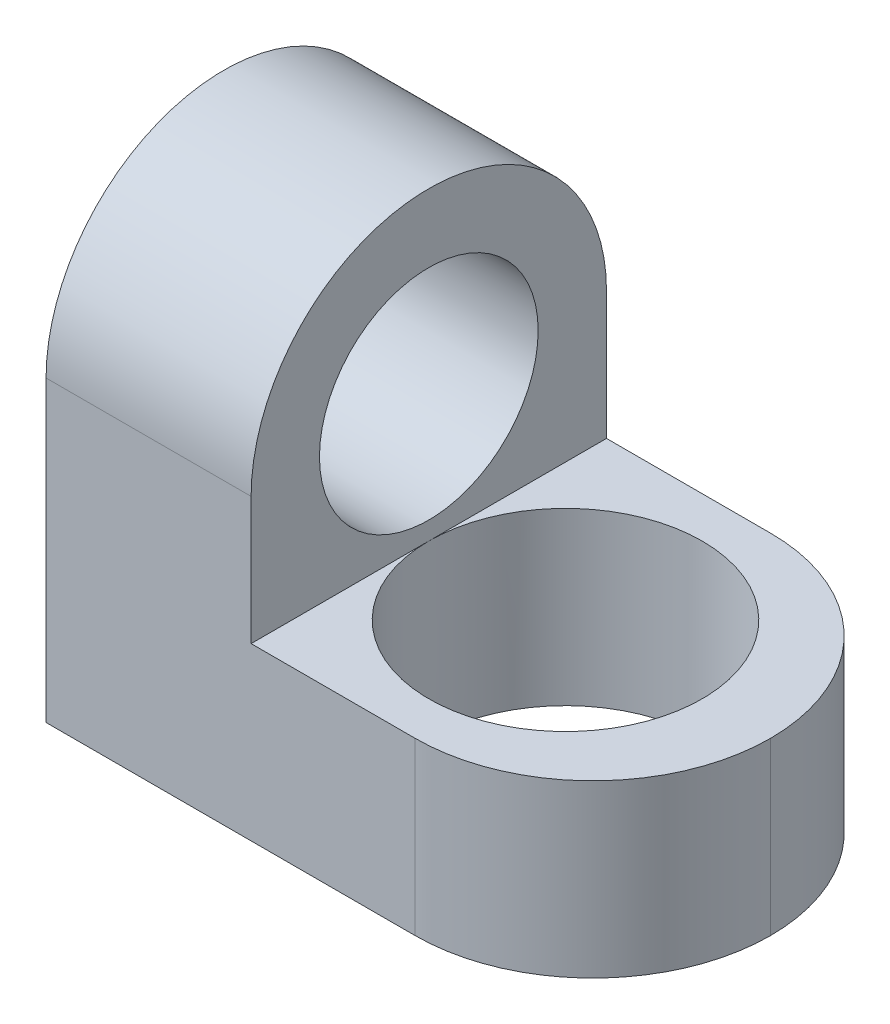
ISO-10303-21;
HEADER;
FILE_DESCRIPTION(('STEP AP214'),'2;1');
FILE_NAME('part.step','',(''),(''),'','','');
FILE_SCHEMA(('AUTOMOTIVE_DESIGN { 1 0 10303 214 1 1 1 1 }'));
ENDSEC;
DATA;
#1=APPLICATION_CONTEXT('core data for automotive mechanical design processes');
#2=APPLICATION_PROTOCOL_DEFINITION('international standard','automotive_design',2000,#1);
#3=PRODUCT_CONTEXT('',#1,'mechanical');
#4=PRODUCT('Part','Part','',(#3));
#5=PRODUCT_RELATED_PRODUCT_CATEGORY('part','',(#4));
#6=PRODUCT_DEFINITION_FORMATION('','',#4);
#7=PRODUCT_DEFINITION_CONTEXT('part definition',#1,'design');
#8=PRODUCT_DEFINITION('design','',#6,#7);
#9=PRODUCT_DEFINITION_SHAPE('','',#8);
#10=(LENGTH_UNIT() NAMED_UNIT(*) SI_UNIT(.MILLI.,.METRE.));
#11=(NAMED_UNIT(*) PLANE_ANGLE_UNIT() SI_UNIT($,.RADIAN.));
#12=(NAMED_UNIT(*) SI_UNIT($,.STERADIAN.) SOLID_ANGLE_UNIT());
#13=UNCERTAINTY_MEASURE_WITH_UNIT(LENGTH_MEASURE(1.E-05),#10,'distance_accuracy_value','');
#14=(GEOMETRIC_REPRESENTATION_CONTEXT(3) GLOBAL_UNCERTAINTY_ASSIGNED_CONTEXT((#13)) GLOBAL_UNIT_ASSIGNED_CONTEXT((#10,
#11,#12)) REPRESENTATION_CONTEXT('',''));
#15=CARTESIAN_POINT('',(0.,0.,0.));
#16=DIRECTION('',(0.,0.,1.));
#17=DIRECTION('',(1.,0.,0.));
#18=AXIS2_PLACEMENT_3D('',#15,#16,#17);
#19=CARTESIAN_POINT('',(3.,0.,-2.6));
#20=DIRECTION('',(0.,0.,-1.));
#21=DIRECTION('',(-1.,0.,0.));
#22=AXIS2_PLACEMENT_3D('',#19,#20,#21);
#23=PLANE('',#22);
#24=DIRECTION('',(-1.,0.,0.));
#25=VECTOR('',#24,1.);
#26=CARTESIAN_POINT('',(8.,-1.86570148321339,-2.6));
#27=LINE('',#26,#25);
#28=CARTESIAN_POINT('',(5.4,-1.86570148321339,-2.6));
#29=VERTEX_POINT('',#28);
#30=CARTESIAN_POINT('',(3.,-1.86570148321339,-2.6));
#31=VERTEX_POINT('',#30);
#32=EDGE_CURVE('E114',#29,#31,#27,.T.);
#33=ORIENTED_EDGE('',*,*,#32,.F.);
#34=DIRECTION('',(0.,1.,0.));
#35=VECTOR('',#34,1.);
#36=CARTESIAN_POINT('',(5.4,-4.36570148321339,-2.6));
#37=LINE('',#36,#35);
#38=CARTESIAN_POINT('',(5.4,-4.36570148321339,-2.6));
#39=VERTEX_POINT('',#38);
#40=EDGE_CURVE('E155',#29,#39,#37,.F.);
#41=ORIENTED_EDGE('',*,*,#40,.T.);
#42=DIRECTION('',(-1.,0.,0.));
#43=VECTOR('',#42,1.);
#44=CARTESIAN_POINT('',(3.,-4.36570148321339,-2.6));
#45=LINE('',#44,#43);
#46=CARTESIAN_POINT('',(0.,-4.36570148321339,-2.6));
#47=VERTEX_POINT('',#46);
#48=EDGE_CURVE('E122',#39,#47,#45,.T.);
#49=ORIENTED_EDGE('',*,*,#48,.T.);
#50=DIRECTION('',(0.,-1.,0.));
#51=VECTOR('',#50,1.);
#52=CARTESIAN_POINT('',(0.,0.,-2.6));
#53=LINE('',#52,#51);
#54=CARTESIAN_POINT('',(0.,0.,-2.6));
#55=VERTEX_POINT('',#54);
#56=EDGE_CURVE('E133',#55,#47,#53,.T.);
#57=ORIENTED_EDGE('',*,*,#56,.F.);
#58=DIRECTION('',(-1.,0.,0.));
#59=VECTOR('',#58,1.);
#60=CARTESIAN_POINT('',(3.,0.,-2.6));
#61=LINE('',#60,#59);
#62=CARTESIAN_POINT('',(3.,0.,-2.6));
#63=VERTEX_POINT('',#62);
#64=EDGE_CURVE('E149',#63,#55,#61,.T.);
#65=ORIENTED_EDGE('',*,*,#64,.F.);
#66=DIRECTION('',(0.,-1.,0.));
#67=VECTOR('',#66,1.);
#68=CARTESIAN_POINT('',(3.,0.,-2.6));
#69=LINE('',#68,#67);
#70=EDGE_CURVE('E126',#63,#31,#69,.T.);
#71=ORIENTED_EDGE('',*,*,#70,.T.);
#72=EDGE_LOOP('',(#33,#41,#49,#57,#65,#71));
#73=FACE_BOUND('',#72,.T.);
#74=ADVANCED_FACE('F35',(#73),#23,.T.);
#75=CARTESIAN_POINT('',(3.,0.,0.));
#76=DIRECTION('',(-1.,0.,0.));
#77=DIRECTION('',(0.,0.,1.));
#78=AXIS2_PLACEMENT_3D('',#75,#76,#77);
#79=CYLINDRICAL_SURFACE('',#78,2.6);
#80=CARTESIAN_POINT('',(0.,0.,0.));
#81=DIRECTION('',(1.,0.,0.));
#82=DIRECTION('',(0.,0.,-1.));
#83=AXIS2_PLACEMENT_3D('',#80,#81,#82);
#84=CIRCLE('',#83,2.6);
#85=CARTESIAN_POINT('',(0.,0.,2.6));
#86=VERTEX_POINT('',#85);
#87=EDGE_CURVE('E136',#55,#86,#84,.T.);
#88=ORIENTED_EDGE('',*,*,#87,.T.);
#89=DIRECTION('',(-1.,0.,0.));
#90=VECTOR('',#89,1.);
#91=CARTESIAN_POINT('',(3.,0.,2.6));
#92=LINE('',#91,#90);
#93=CARTESIAN_POINT('',(3.,0.,2.6));
#94=VERTEX_POINT('',#93);
#95=EDGE_CURVE('E147',#94,#86,#92,.T.);
#96=ORIENTED_EDGE('',*,*,#95,.F.);
#97=CARTESIAN_POINT('',(3.,0.,0.));
#98=DIRECTION('',(1.,0.,0.));
#99=DIRECTION('',(0.,0.,-1.));
#100=AXIS2_PLACEMENT_3D('',#97,#98,#99);
#101=CIRCLE('',#100,2.6);
#102=EDGE_CURVE('E120',#63,#94,#101,.T.);
#103=ORIENTED_EDGE('',*,*,#102,.F.);
#104=ORIENTED_EDGE('',*,*,#64,.T.);
#105=EDGE_LOOP('',(#88,#96,#103,#104));
#106=FACE_BOUND('',#105,.T.);
#107=ADVANCED_FACE('F184',(#106),#79,.T.);
#108=CARTESIAN_POINT('',(3.,0.,2.6));
#109=DIRECTION('',(0.,0.,-1.));
#110=DIRECTION('',(-1.,0.,0.));
#111=AXIS2_PLACEMENT_3D('',#108,#109,#110);
#112=PLANE('',#111);
#113=DIRECTION('',(-1.,0.,0.));
#114=VECTOR('',#113,1.);
#115=CARTESIAN_POINT('',(3.,-4.36570148321339,2.6));
#116=LINE('',#115,#114);
#117=CARTESIAN_POINT('',(5.4,-4.36570148321339,2.6));
#118=VERTEX_POINT('',#117);
#119=CARTESIAN_POINT('',(0.,-4.36570148321339,2.6));
#120=VERTEX_POINT('',#119);
#121=EDGE_CURVE('E124',#118,#120,#116,.T.);
#122=ORIENTED_EDGE('',*,*,#121,.F.);
#123=DIRECTION('',(0.,-1.,0.));
#124=VECTOR('',#123,1.);
#125=CARTESIAN_POINT('',(5.4,0.,2.6));
#126=LINE('',#125,#124);
#127=CARTESIAN_POINT('',(5.4,-1.86570148321339,2.6));
#128=VERTEX_POINT('',#127);
#129=EDGE_CURVE('E11',#118,#128,#126,.F.);
#130=ORIENTED_EDGE('',*,*,#129,.T.);
#131=DIRECTION('',(-1.,0.,0.));
#132=VECTOR('',#131,1.);
#133=CARTESIAN_POINT('',(8.,-1.86570148321339,2.6));
#134=LINE('',#133,#132);
#135=CARTESIAN_POINT('',(3.,-1.86570148321339,2.6));
#136=VERTEX_POINT('',#135);
#137=EDGE_CURVE('E100',#128,#136,#134,.T.);
#138=ORIENTED_EDGE('',*,*,#137,.T.);
#139=DIRECTION('',(0.,-1.,0.));
#140=VECTOR('',#139,1.);
#141=CARTESIAN_POINT('',(3.,0.,2.6));
#142=LINE('',#141,#140);
#143=EDGE_CURVE('E111',#94,#136,#142,.T.);
#144=ORIENTED_EDGE('',*,*,#143,.F.);
#145=ORIENTED_EDGE('',*,*,#95,.T.);
#146=DIRECTION('',(0.,-1.,0.));
#147=VECTOR('',#146,1.);
#148=CARTESIAN_POINT('',(0.,0.,2.6));
#149=LINE('',#148,#147);
#150=EDGE_CURVE('E139',#86,#120,#149,.T.);
#151=ORIENTED_EDGE('',*,*,#150,.T.);
#152=EDGE_LOOP('',(#122,#130,#138,#144,#145,#151));
#153=FACE_BOUND('',#152,.T.);
#154=ADVANCED_FACE('F109',(#153),#112,.F.);
#155=CARTESIAN_POINT('',(3.,0.,0.));
#156=DIRECTION('',(-1.,0.,0.));
#157=DIRECTION('',(0.,0.,1.));
#158=AXIS2_PLACEMENT_3D('',#155,#156,#157);
#159=CYLINDRICAL_SURFACE('',#158,1.6);
#160=CARTESIAN_POINT('',(3.,0.,0.));
#161=DIRECTION('',(1.,0.,0.));
#162=DIRECTION('',(0.,0.,-1.));
#163=AXIS2_PLACEMENT_3D('',#160,#161,#162);
#164=CIRCLE('',#163,1.6);
#165=CARTESIAN_POINT('',(3.,0.,-1.6));
#166=VERTEX_POINT('',#165);
#167=EDGE_CURVE('E144',#166,#166,#164,.T.);
#168=ORIENTED_EDGE('',*,*,#167,.T.);
#169=EDGE_LOOP('',(#168));
#170=FACE_BOUND('',#169,.T.);
#171=CARTESIAN_POINT('',(0.,0.,0.));
#172=DIRECTION('',(1.,0.,0.));
#173=DIRECTION('',(0.,0.,-1.));
#174=AXIS2_PLACEMENT_3D('',#171,#172,#173);
#175=CIRCLE('',#174,1.6);
#176=CARTESIAN_POINT('',(0.,0.,-1.6));
#177=VERTEX_POINT('',#176);
#178=EDGE_CURVE('E130',#177,#177,#175,.T.);
#179=ORIENTED_EDGE('',*,*,#178,.F.);
#180=EDGE_LOOP('',(#179));
#181=FACE_BOUND('',#180,.T.);
#182=ADVANCED_FACE('F201',(#170,#181),#159,.F.);
#183=CARTESIAN_POINT('',(3.,-4.36570148321339,0.));
#184=DIRECTION('',(0.,1.,0.));
#185=DIRECTION('',(0.,0.,1.));
#186=AXIS2_PLACEMENT_3D('',#183,#184,#185);
#187=PLANE('',#186);
#188=CARTESIAN_POINT('',(5.,-4.36570148321339,0.));
#189=DIRECTION('',(0.,-1.,0.));
#190=DIRECTION('',(0.,0.,-1.));
#191=AXIS2_PLACEMENT_3D('',#188,#189,#190);
#192=CIRCLE('',#191,2.);
#193=CARTESIAN_POINT('',(5.,-4.36570148321339,-2.));
#194=VERTEX_POINT('',#193);
#195=EDGE_CURVE('E163',#194,#194,#192,.T.);
#196=ORIENTED_EDGE('',*,*,#195,.F.);
#197=EDGE_LOOP('',(#196));
#198=FACE_BOUND('',#197,.T.);
#199=ORIENTED_EDGE('',*,*,#48,.F.);
#200=CARTESIAN_POINT('',(5.4,-4.36570148321339,0.));
#201=DIRECTION('',(0.,1.,0.));
#202=DIRECTION('',(0.,0.,1.));
#203=AXIS2_PLACEMENT_3D('',#200,#201,#202);
#204=CIRCLE('',#203,2.6);
#205=CARTESIAN_POINT('',(8.,-4.36570148321339,0.));
#206=VERTEX_POINT('',#205);
#207=EDGE_CURVE('E44',#39,#206,#204,.F.);
#208=ORIENTED_EDGE('',*,*,#207,.T.);
#209=CARTESIAN_POINT('',(5.4,-4.36570148321339,0.));
#210=DIRECTION('',(0.,1.,0.));
#211=DIRECTION('',(0.,0.,1.));
#212=AXIS2_PLACEMENT_3D('',#209,#210,#211);
#213=CIRCLE('',#212,2.6);
#214=EDGE_CURVE('E56',#206,#118,#213,.F.);
#215=ORIENTED_EDGE('',*,*,#214,.T.);
#216=ORIENTED_EDGE('',*,*,#121,.T.);
#217=DIRECTION('',(0.,0.,-1.));
#218=VECTOR('',#217,1.);
#219=CARTESIAN_POINT('',(0.,-4.36570148321339,0.));
#220=LINE('',#219,#218);
#221=EDGE_CURVE('E142',#120,#47,#220,.T.);
#222=ORIENTED_EDGE('',*,*,#221,.T.);
#223=EDGE_LOOP('',(#199,#208,#215,#216,#222));
#224=FACE_BOUND('',#223,.T.);
#225=ADVANCED_FACE('F178',(#198,#224),#187,.F.);
#226=CARTESIAN_POINT('',(3.,0.,0.));
#227=DIRECTION('',(1.,0.,0.));
#228=DIRECTION('',(0.,0.,-1.));
#229=AXIS2_PLACEMENT_3D('',#226,#227,#228);
#230=PLANE('',#229);
#231=DIRECTION('',(0.,0.,1.));
#232=VECTOR('',#231,1.);
#233=CARTESIAN_POINT('',(3.,-1.86570148321339,2.6));
#234=LINE('',#233,#232);
#235=CARTESIAN_POINT('',(3.,-1.86570148321339,0.));
#236=VERTEX_POINT('',#235);
#237=EDGE_CURVE('E96',#236,#136,#234,.T.);
#238=ORIENTED_EDGE('',*,*,#237,.F.);
#239=EDGE_CURVE('E105',#31,#236,#234,.T.);
#240=ORIENTED_EDGE('',*,*,#239,.F.);
#241=ORIENTED_EDGE('',*,*,#70,.F.);
#242=ORIENTED_EDGE('',*,*,#102,.T.);
#243=ORIENTED_EDGE('',*,*,#143,.T.);
#244=EDGE_LOOP('',(#238,#240,#241,#242,#243));
#245=FACE_BOUND('',#244,.T.);
#246=ORIENTED_EDGE('',*,*,#167,.F.);
#247=EDGE_LOOP('',(#246));
#248=FACE_BOUND('',#247,.T.);
#249=ADVANCED_FACE('F116',(#245,#248),#230,.T.);
#250=CARTESIAN_POINT('',(0.,0.,0.));
#251=DIRECTION('',(1.,0.,0.));
#252=DIRECTION('',(0.,0.,-1.));
#253=AXIS2_PLACEMENT_3D('',#250,#251,#252);
#254=PLANE('',#253);
#255=ORIENTED_EDGE('',*,*,#178,.T.);
#256=EDGE_LOOP('',(#255));
#257=FACE_BOUND('',#256,.T.);
#258=ORIENTED_EDGE('',*,*,#56,.T.);
#259=ORIENTED_EDGE('',*,*,#221,.F.);
#260=ORIENTED_EDGE('',*,*,#150,.F.);
#261=ORIENTED_EDGE('',*,*,#87,.F.);
#262=EDGE_LOOP('',(#258,#259,#260,#261));
#263=FACE_BOUND('',#262,.T.);
#264=ADVANCED_FACE('F182',(#257,#263),#254,.F.);
#265=CARTESIAN_POINT('',(8.,-1.86570148321339,2.6));
#266=DIRECTION('',(0.,-1.,0.));
#267=DIRECTION('',(0.,0.,-1.));
#268=AXIS2_PLACEMENT_3D('',#265,#266,#267);
#269=PLANE('',#268);
#270=ORIENTED_EDGE('',*,*,#239,.T.);
#271=CARTESIAN_POINT('',(5.,-1.86570148321339,0.));
#272=DIRECTION('',(0.,-1.,0.));
#273=DIRECTION('',(0.,0.,-1.));
#274=AXIS2_PLACEMENT_3D('',#271,#272,#273);
#275=CIRCLE('',#274,2.);
#276=EDGE_CURVE('E39',#236,#236,#275,.T.);
#277=ORIENTED_EDGE('',*,*,#276,.T.);
#278=ORIENTED_EDGE('',*,*,#237,.T.);
#279=ORIENTED_EDGE('',*,*,#137,.F.);
#280=CARTESIAN_POINT('',(5.4,-1.86570148321339,0.));
#281=DIRECTION('',(0.,-1.,0.));
#282=DIRECTION('',(0.,0.,-1.));
#283=AXIS2_PLACEMENT_3D('',#280,#281,#282);
#284=CIRCLE('',#283,2.6);
#285=CARTESIAN_POINT('',(8.,-1.86570148321339,0.));
#286=VERTEX_POINT('',#285);
#287=EDGE_CURVE('E151',#128,#286,#284,.F.);
#288=ORIENTED_EDGE('',*,*,#287,.T.);
#289=CARTESIAN_POINT('',(5.4,-1.86570148321339,0.));
#290=DIRECTION('',(0.,-1.,0.));
#291=DIRECTION('',(0.,0.,-1.));
#292=AXIS2_PLACEMENT_3D('',#289,#290,#291);
#293=CIRCLE('',#292,2.6);
#294=EDGE_CURVE('E153',#286,#29,#293,.F.);
#295=ORIENTED_EDGE('',*,*,#294,.T.);
#296=ORIENTED_EDGE('',*,*,#32,.T.);
#297=EDGE_LOOP('',(#270,#277,#278,#279,#288,#295,#296));
#298=FACE_BOUND('',#297,.T.);
#299=ADVANCED_FACE('F99',(#298),#269,.F.);
#300=CARTESIAN_POINT('',(5.4,0.,0.));
#301=DIRECTION('',(0.,-1.,0.));
#302=DIRECTION('',(0.,0.,-1.));
#303=AXIS2_PLACEMENT_3D('',#300,#301,#302);
#304=CYLINDRICAL_SURFACE('',#303,2.6);
#305=ORIENTED_EDGE('',*,*,#129,.F.);
#306=ORIENTED_EDGE('',*,*,#214,.F.);
#307=DIRECTION('',(0.,-1.,0.));
#308=VECTOR('',#307,1.);
#309=CARTESIAN_POINT('',(8.,0.,0.));
#310=LINE('',#309,#308);
#311=EDGE_CURVE('E106',#286,#206,#310,.T.);
#312=ORIENTED_EDGE('',*,*,#311,.F.);
#313=ORIENTED_EDGE('',*,*,#287,.F.);
#314=EDGE_LOOP('',(#305,#306,#312,#313));
#315=FACE_BOUND('',#314,.T.);
#316=ADVANCED_FACE('F37',(#315),#304,.T.);
#317=CARTESIAN_POINT('',(5.4,0.,0.));
#318=DIRECTION('',(0.,-1.,0.));
#319=DIRECTION('',(0.,0.,-1.));
#320=AXIS2_PLACEMENT_3D('',#317,#318,#319);
#321=CYLINDRICAL_SURFACE('',#320,2.6);
#322=ORIENTED_EDGE('',*,*,#207,.F.);
#323=ORIENTED_EDGE('',*,*,#40,.F.);
#324=ORIENTED_EDGE('',*,*,#294,.F.);
#325=ORIENTED_EDGE('',*,*,#311,.T.);
#326=EDGE_LOOP('',(#322,#323,#324,#325));
#327=FACE_BOUND('',#326,.T.);
#328=ADVANCED_FACE('F176',(#327),#321,.T.);
#329=CARTESIAN_POINT('',(5.,0.634298516786613,0.));
#330=DIRECTION('',(0.,-1.,0.));
#331=DIRECTION('',(0.,0.,-1.));
#332=AXIS2_PLACEMENT_3D('',#329,#330,#331);
#333=CYLINDRICAL_SURFACE('',#332,2.);
#334=ORIENTED_EDGE('',*,*,#195,.T.);
#335=EDGE_LOOP('',(#334));
#336=FACE_BOUND('',#335,.T.);
#337=ORIENTED_EDGE('',*,*,#276,.F.);
#338=EDGE_LOOP('',(#337));
#339=FACE_BOUND('',#338,.T.);
#340=ADVANCED_FACE('F191',(#336,#339),#333,.F.);
#341=CLOSED_SHELL('',(#74,#107,#154,#182,#225,#249,#264,#299,#316,#328,#340));
#342=MANIFOLD_SOLID_BREP('B2',#341);
#343=ADVANCED_BREP_SHAPE_REPRESENTATION('',(#18,#342),#14);
#344=SHAPE_DEFINITION_REPRESENTATION(#9,#343);
ENDSEC;
END-ISO-10303-21;
